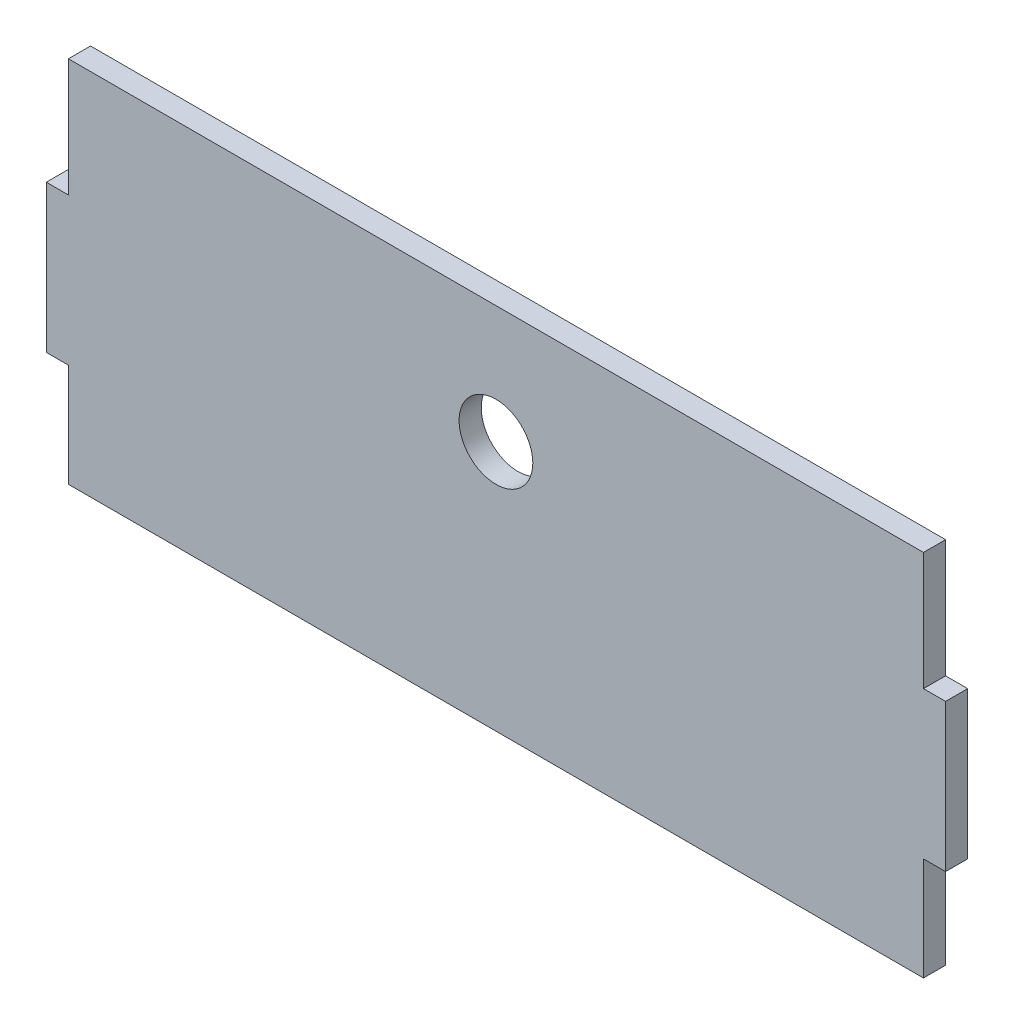
ISO-10303-21;
HEADER;
FILE_DESCRIPTION(('STEP AP214'),'2;1');
FILE_NAME('part.step','',(''),(''),'','','');
FILE_SCHEMA(('AUTOMOTIVE_DESIGN { 1 0 10303 214 1 1 1 1 }'));
ENDSEC;
DATA;
#1=APPLICATION_CONTEXT('core data for automotive mechanical design processes');
#2=APPLICATION_PROTOCOL_DEFINITION('international standard','automotive_design',2000,#1);
#3=PRODUCT_CONTEXT('',#1,'mechanical');
#4=PRODUCT('Part','Part','',(#3));
#5=PRODUCT_RELATED_PRODUCT_CATEGORY('part','',(#4));
#6=PRODUCT_DEFINITION_FORMATION('','',#4);
#7=PRODUCT_DEFINITION_CONTEXT('part definition',#1,'design');
#8=PRODUCT_DEFINITION('design','',#6,#7);
#9=PRODUCT_DEFINITION_SHAPE('','',#8);
#10=(LENGTH_UNIT() NAMED_UNIT(*) SI_UNIT(.MILLI.,.METRE.));
#11=(NAMED_UNIT(*) PLANE_ANGLE_UNIT() SI_UNIT($,.RADIAN.));
#12=(NAMED_UNIT(*) SI_UNIT($,.STERADIAN.) SOLID_ANGLE_UNIT());
#13=UNCERTAINTY_MEASURE_WITH_UNIT(LENGTH_MEASURE(1.E-05),#10,'distance_accuracy_value','');
#14=(GEOMETRIC_REPRESENTATION_CONTEXT(3) GLOBAL_UNCERTAINTY_ASSIGNED_CONTEXT((#13)) GLOBAL_UNIT_ASSIGNED_CONTEXT((#10,
#11,#12)) REPRESENTATION_CONTEXT('',''));
#15=CARTESIAN_POINT('',(0.,0.,0.));
#16=DIRECTION('',(0.,0.,1.));
#17=DIRECTION('',(1.,0.,0.));
#18=AXIS2_PLACEMENT_3D('',#15,#16,#17);
#19=CARTESIAN_POINT('',(0.,0.,3.));
#20=DIRECTION('',(0.,0.,1.));
#21=DIRECTION('',(1.,0.,0.));
#22=AXIS2_PLACEMENT_3D('',#19,#20,#21);
#23=PLANE('',#22);
#24=DIRECTION('',(-1.,0.,0.));
#25=VECTOR('',#24,1.);
#26=CARTESIAN_POINT('',(-58.,10.,3.));
#27=LINE('',#26,#25);
#28=CARTESIAN_POINT('',(-58.,10.,3.));
#29=VERTEX_POINT('',#28);
#30=CARTESIAN_POINT('',(-61.,10.,3.));
#31=VERTEX_POINT('',#30);
#32=EDGE_CURVE('E200',#29,#31,#27,.T.);
#33=ORIENTED_EDGE('',*,*,#32,.T.);
#34=DIRECTION('',(0.,-1.,0.));
#35=VECTOR('',#34,1.);
#36=CARTESIAN_POINT('',(-61.,10.,3.));
#37=LINE('',#36,#35);
#38=CARTESIAN_POINT('',(-61.,-10.,3.));
#39=VERTEX_POINT('',#38);
#40=EDGE_CURVE('E112',#31,#39,#37,.T.);
#41=ORIENTED_EDGE('',*,*,#40,.T.);
#42=DIRECTION('',(1.,0.,0.));
#43=VECTOR('',#42,1.);
#44=CARTESIAN_POINT('',(-61.,-10.,3.));
#45=LINE('',#44,#43);
#46=CARTESIAN_POINT('',(-58.,-10.,3.));
#47=VERTEX_POINT('',#46);
#48=EDGE_CURVE('E237',#39,#47,#45,.T.);
#49=ORIENTED_EDGE('',*,*,#48,.T.);
#50=DIRECTION('',(0.,-1.,0.));
#51=VECTOR('',#50,1.);
#52=CARTESIAN_POINT('',(-58.,-10.,3.));
#53=LINE('',#52,#51);
#54=CARTESIAN_POINT('',(-58.,-24.,3.));
#55=VERTEX_POINT('',#54);
#56=EDGE_CURVE('E257',#47,#55,#53,.T.);
#57=ORIENTED_EDGE('',*,*,#56,.T.);
#58=DIRECTION('',(1.,0.,0.));
#59=VECTOR('',#58,1.);
#60=CARTESIAN_POINT('',(-58.,-24.,3.));
#61=LINE('',#60,#59);
#62=CARTESIAN_POINT('',(58.,-24.,3.));
#63=VERTEX_POINT('',#62);
#64=EDGE_CURVE('E253',#55,#63,#61,.T.);
#65=ORIENTED_EDGE('',*,*,#64,.T.);
#66=DIRECTION('',(0.,1.,0.));
#67=VECTOR('',#66,1.);
#68=CARTESIAN_POINT('',(58.,-24.,3.));
#69=LINE('',#68,#67);
#70=CARTESIAN_POINT('',(58.,-10.,3.));
#71=VERTEX_POINT('',#70);
#72=EDGE_CURVE('E256',#63,#71,#69,.T.);
#73=ORIENTED_EDGE('',*,*,#72,.T.);
#74=DIRECTION('',(1.,0.,0.));
#75=VECTOR('',#74,1.);
#76=CARTESIAN_POINT('',(58.,-10.,3.));
#77=LINE('',#76,#75);
#78=CARTESIAN_POINT('',(61.,-10.,3.));
#79=VERTEX_POINT('',#78);
#80=EDGE_CURVE('E261',#71,#79,#77,.T.);
#81=ORIENTED_EDGE('',*,*,#80,.T.);
#82=DIRECTION('',(0.,1.,0.));
#83=VECTOR('',#82,1.);
#84=CARTESIAN_POINT('',(61.,-10.,3.));
#85=LINE('',#84,#83);
#86=CARTESIAN_POINT('',(61.,10.,3.));
#87=VERTEX_POINT('',#86);
#88=EDGE_CURVE('E268',#79,#87,#85,.T.);
#89=ORIENTED_EDGE('',*,*,#88,.T.);
#90=DIRECTION('',(-1.,0.,0.));
#91=VECTOR('',#90,1.);
#92=CARTESIAN_POINT('',(61.,10.,3.));
#93=LINE('',#92,#91);
#94=CARTESIAN_POINT('',(58.,10.,3.));
#95=VERTEX_POINT('',#94);
#96=EDGE_CURVE('E143',#87,#95,#93,.T.);
#97=ORIENTED_EDGE('',*,*,#96,.T.);
#98=DIRECTION('',(0.,1.,0.));
#99=VECTOR('',#98,1.);
#100=CARTESIAN_POINT('',(58.,10.,3.));
#101=LINE('',#100,#99);
#102=CARTESIAN_POINT('',(58.,26.,3.));
#103=VERTEX_POINT('',#102);
#104=EDGE_CURVE('E137',#95,#103,#101,.T.);
#105=ORIENTED_EDGE('',*,*,#104,.T.);
#106=DIRECTION('',(-1.,0.,0.));
#107=VECTOR('',#106,1.);
#108=CARTESIAN_POINT('',(58.,26.,3.));
#109=LINE('',#108,#107);
#110=CARTESIAN_POINT('',(-58.,26.,3.));
#111=VERTEX_POINT('',#110);
#112=EDGE_CURVE('E141',#103,#111,#109,.T.);
#113=ORIENTED_EDGE('',*,*,#112,.T.);
#114=DIRECTION('',(0.,-1.,0.));
#115=VECTOR('',#114,1.);
#116=CARTESIAN_POINT('',(-58.,26.,3.));
#117=LINE('',#116,#115);
#118=EDGE_CURVE('E57',#111,#29,#117,.T.);
#119=ORIENTED_EDGE('',*,*,#118,.T.);
#120=EDGE_LOOP('',(#33,#41,#49,#57,#65,#73,#81,#89,#97,#105,#113,#119));
#121=FACE_BOUND('',#120,.T.);
#122=CARTESIAN_POINT('',(0.,10.,3.));
#123=DIRECTION('',(0.,0.,1.));
#124=DIRECTION('',(1.,0.,0.));
#125=AXIS2_PLACEMENT_3D('',#122,#123,#124);
#126=CIRCLE('',#125,5.);
#127=CARTESIAN_POINT('',(5.,10.,3.));
#128=VERTEX_POINT('',#127);
#129=EDGE_CURVE('E170',#128,#128,#126,.T.);
#130=ORIENTED_EDGE('',*,*,#129,.F.);
#131=EDGE_LOOP('',(#130));
#132=FACE_BOUND('',#131,.T.);
#133=ADVANCED_FACE('F39',(#121,#132),#23,.T.);
#134=CARTESIAN_POINT('',(0.,0.,0.));
#135=DIRECTION('',(0.,0.,1.));
#136=DIRECTION('',(1.,0.,0.));
#137=AXIS2_PLACEMENT_3D('',#134,#135,#136);
#138=PLANE('',#137);
#139=DIRECTION('',(-1.,0.,0.));
#140=VECTOR('',#139,1.);
#141=CARTESIAN_POINT('',(-58.,10.,0.));
#142=LINE('',#141,#140);
#143=CARTESIAN_POINT('',(-58.,10.,0.));
#144=VERTEX_POINT('',#143);
#145=CARTESIAN_POINT('',(-61.,10.,0.));
#146=VERTEX_POINT('',#145);
#147=EDGE_CURVE('E165',#144,#146,#142,.T.);
#148=ORIENTED_EDGE('',*,*,#147,.F.);
#149=DIRECTION('',(0.,-1.,0.));
#150=VECTOR('',#149,1.);
#151=CARTESIAN_POINT('',(-58.,26.,0.));
#152=LINE('',#151,#150);
#153=CARTESIAN_POINT('',(-58.,26.,0.));
#154=VERTEX_POINT('',#153);
#155=EDGE_CURVE('E104',#154,#144,#152,.T.);
#156=ORIENTED_EDGE('',*,*,#155,.F.);
#157=DIRECTION('',(-1.,0.,0.));
#158=VECTOR('',#157,1.);
#159=CARTESIAN_POINT('',(58.,26.,0.));
#160=LINE('',#159,#158);
#161=CARTESIAN_POINT('',(58.,26.,0.));
#162=VERTEX_POINT('',#161);
#163=EDGE_CURVE('E98',#162,#154,#160,.T.);
#164=ORIENTED_EDGE('',*,*,#163,.F.);
#165=DIRECTION('',(0.,1.,0.));
#166=VECTOR('',#165,1.);
#167=CARTESIAN_POINT('',(58.,10.,0.));
#168=LINE('',#167,#166);
#169=CARTESIAN_POINT('',(58.,10.,0.));
#170=VERTEX_POINT('',#169);
#171=EDGE_CURVE('E152',#170,#162,#168,.T.);
#172=ORIENTED_EDGE('',*,*,#171,.F.);
#173=DIRECTION('',(-1.,0.,0.));
#174=VECTOR('',#173,1.);
#175=CARTESIAN_POINT('',(61.,10.,0.));
#176=LINE('',#175,#174);
#177=CARTESIAN_POINT('',(61.,10.,0.));
#178=VERTEX_POINT('',#177);
#179=EDGE_CURVE('E191',#178,#170,#176,.T.);
#180=ORIENTED_EDGE('',*,*,#179,.F.);
#181=DIRECTION('',(0.,1.,0.));
#182=VECTOR('',#181,1.);
#183=CARTESIAN_POINT('',(61.,-10.,0.));
#184=LINE('',#183,#182);
#185=CARTESIAN_POINT('',(61.,-10.,0.));
#186=VERTEX_POINT('',#185);
#187=EDGE_CURVE('E188',#186,#178,#184,.T.);
#188=ORIENTED_EDGE('',*,*,#187,.F.);
#189=DIRECTION('',(1.,0.,0.));
#190=VECTOR('',#189,1.);
#191=CARTESIAN_POINT('',(58.,-10.,0.));
#192=LINE('',#191,#190);
#193=CARTESIAN_POINT('',(58.,-10.,0.));
#194=VERTEX_POINT('',#193);
#195=EDGE_CURVE('E185',#194,#186,#192,.T.);
#196=ORIENTED_EDGE('',*,*,#195,.F.);
#197=DIRECTION('',(0.,1.,0.));
#198=VECTOR('',#197,1.);
#199=CARTESIAN_POINT('',(58.,-24.,0.));
#200=LINE('',#199,#198);
#201=CARTESIAN_POINT('',(58.,-24.,0.));
#202=VERTEX_POINT('',#201);
#203=EDGE_CURVE('E182',#202,#194,#200,.T.);
#204=ORIENTED_EDGE('',*,*,#203,.F.);
#205=DIRECTION('',(1.,0.,0.));
#206=VECTOR('',#205,1.);
#207=CARTESIAN_POINT('',(-58.,-24.,0.));
#208=LINE('',#207,#206);
#209=CARTESIAN_POINT('',(-58.,-24.,0.));
#210=VERTEX_POINT('',#209);
#211=EDGE_CURVE('E179',#210,#202,#208,.T.);
#212=ORIENTED_EDGE('',*,*,#211,.F.);
#213=DIRECTION('',(0.,-1.,0.));
#214=VECTOR('',#213,1.);
#215=CARTESIAN_POINT('',(-58.,-10.,0.));
#216=LINE('',#215,#214);
#217=CARTESIAN_POINT('',(-58.,-10.,0.));
#218=VERTEX_POINT('',#217);
#219=EDGE_CURVE('E176',#218,#210,#216,.T.);
#220=ORIENTED_EDGE('',*,*,#219,.F.);
#221=DIRECTION('',(1.,0.,0.));
#222=VECTOR('',#221,1.);
#223=CARTESIAN_POINT('',(-61.,-10.,0.));
#224=LINE('',#223,#222);
#225=CARTESIAN_POINT('',(-61.,-10.,0.));
#226=VERTEX_POINT('',#225);
#227=EDGE_CURVE('E173',#226,#218,#224,.T.);
#228=ORIENTED_EDGE('',*,*,#227,.F.);
#229=DIRECTION('',(0.,-1.,0.));
#230=VECTOR('',#229,1.);
#231=CARTESIAN_POINT('',(-61.,10.,0.));
#232=LINE('',#231,#230);
#233=EDGE_CURVE('E169',#146,#226,#232,.T.);
#234=ORIENTED_EDGE('',*,*,#233,.F.);
#235=EDGE_LOOP('',(#148,#156,#164,#172,#180,#188,#196,#204,#212,#220,#228,#234));
#236=FACE_BOUND('',#235,.T.);
#237=CARTESIAN_POINT('',(0.,10.,0.));
#238=DIRECTION('',(0.,0.,1.));
#239=DIRECTION('',(1.,0.,0.));
#240=AXIS2_PLACEMENT_3D('',#237,#238,#239);
#241=CIRCLE('',#240,5.);
#242=CARTESIAN_POINT('',(5.,10.,0.));
#243=VERTEX_POINT('',#242);
#244=EDGE_CURVE('E417',#243,#243,#241,.T.);
#245=ORIENTED_EDGE('',*,*,#244,.T.);
#246=EDGE_LOOP('',(#245));
#247=FACE_BOUND('',#246,.T.);
#248=ADVANCED_FACE('F241',(#236,#247),#138,.F.);
#249=CARTESIAN_POINT('',(-58.,10.,3.));
#250=DIRECTION('',(0.,-1.,0.));
#251=DIRECTION('',(1.,0.,0.));
#252=AXIS2_PLACEMENT_3D('',#249,#250,#251);
#253=PLANE('',#252);
#254=ORIENTED_EDGE('',*,*,#147,.T.);
#255=DIRECTION('',(0.,0.,-1.));
#256=VECTOR('',#255,1.);
#257=CARTESIAN_POINT('',(-61.,10.,3.));
#258=LINE('',#257,#256);
#259=EDGE_CURVE('E11',#31,#146,#258,.T.);
#260=ORIENTED_EDGE('',*,*,#259,.F.);
#261=ORIENTED_EDGE('',*,*,#32,.F.);
#262=DIRECTION('',(0.,0.,-1.));
#263=VECTOR('',#262,1.);
#264=CARTESIAN_POINT('',(-58.,10.,3.));
#265=LINE('',#264,#263);
#266=EDGE_CURVE('E161',#29,#144,#265,.T.);
#267=ORIENTED_EDGE('',*,*,#266,.T.);
#268=EDGE_LOOP('',(#254,#260,#261,#267));
#269=FACE_BOUND('',#268,.T.);
#270=ADVANCED_FACE('F41',(#269),#253,.F.);
#271=CARTESIAN_POINT('',(-61.,10.,3.));
#272=DIRECTION('',(1.,0.,0.));
#273=DIRECTION('',(0.,0.,-1.));
#274=AXIS2_PLACEMENT_3D('',#271,#272,#273);
#275=PLANE('',#274);
#276=ORIENTED_EDGE('',*,*,#233,.T.);
#277=DIRECTION('',(0.,0.,-1.));
#278=VECTOR('',#277,1.);
#279=CARTESIAN_POINT('',(-61.,-10.,3.));
#280=LINE('',#279,#278);
#281=EDGE_CURVE('E49',#39,#226,#280,.T.);
#282=ORIENTED_EDGE('',*,*,#281,.F.);
#283=ORIENTED_EDGE('',*,*,#40,.F.);
#284=ORIENTED_EDGE('',*,*,#259,.T.);
#285=EDGE_LOOP('',(#276,#282,#283,#284));
#286=FACE_BOUND('',#285,.T.);
#287=ADVANCED_FACE('F304',(#286),#275,.F.);
#288=CARTESIAN_POINT('',(-61.,-10.,3.));
#289=DIRECTION('',(0.,1.,0.));
#290=DIRECTION('',(-1.,0.,0.));
#291=AXIS2_PLACEMENT_3D('',#288,#289,#290);
#292=PLANE('',#291);
#293=ORIENTED_EDGE('',*,*,#227,.T.);
#294=DIRECTION('',(0.,0.,-1.));
#295=VECTOR('',#294,1.);
#296=CARTESIAN_POINT('',(-58.,-10.,3.));
#297=LINE('',#296,#295);
#298=EDGE_CURVE('E227',#47,#218,#297,.T.);
#299=ORIENTED_EDGE('',*,*,#298,.F.);
#300=ORIENTED_EDGE('',*,*,#48,.F.);
#301=ORIENTED_EDGE('',*,*,#281,.T.);
#302=EDGE_LOOP('',(#293,#299,#300,#301));
#303=FACE_BOUND('',#302,.T.);
#304=ADVANCED_FACE('F235',(#303),#292,.F.);
#305=CARTESIAN_POINT('',(-58.,-10.,3.));
#306=DIRECTION('',(1.,0.,0.));
#307=DIRECTION('',(0.,1.,0.));
#308=AXIS2_PLACEMENT_3D('',#305,#306,#307);
#309=PLANE('',#308);
#310=ORIENTED_EDGE('',*,*,#219,.T.);
#311=DIRECTION('',(0.,0.,-1.));
#312=VECTOR('',#311,1.);
#313=CARTESIAN_POINT('',(-58.,-24.,3.));
#314=LINE('',#313,#312);
#315=EDGE_CURVE('E223',#55,#210,#314,.T.);
#316=ORIENTED_EDGE('',*,*,#315,.F.);
#317=ORIENTED_EDGE('',*,*,#56,.F.);
#318=ORIENTED_EDGE('',*,*,#298,.T.);
#319=EDGE_LOOP('',(#310,#316,#317,#318));
#320=FACE_BOUND('',#319,.T.);
#321=ADVANCED_FACE('F247',(#320),#309,.F.);
#322=CARTESIAN_POINT('',(-58.,-24.,3.));
#323=DIRECTION('',(0.,1.,0.));
#324=DIRECTION('',(0.,0.,1.));
#325=AXIS2_PLACEMENT_3D('',#322,#323,#324);
#326=PLANE('',#325);
#327=ORIENTED_EDGE('',*,*,#211,.T.);
#328=DIRECTION('',(0.,0.,-1.));
#329=VECTOR('',#328,1.);
#330=CARTESIAN_POINT('',(58.,-24.,3.));
#331=LINE('',#330,#329);
#332=EDGE_CURVE('E219',#63,#202,#331,.T.);
#333=ORIENTED_EDGE('',*,*,#332,.F.);
#334=ORIENTED_EDGE('',*,*,#64,.F.);
#335=ORIENTED_EDGE('',*,*,#315,.T.);
#336=EDGE_LOOP('',(#327,#333,#334,#335));
#337=FACE_BOUND('',#336,.T.);
#338=ADVANCED_FACE('F251',(#337),#326,.F.);
#339=CARTESIAN_POINT('',(58.,-24.,3.));
#340=DIRECTION('',(-1.,0.,0.));
#341=DIRECTION('',(0.,-1.,0.));
#342=AXIS2_PLACEMENT_3D('',#339,#340,#341);
#343=PLANE('',#342);
#344=ORIENTED_EDGE('',*,*,#203,.T.);
#345=DIRECTION('',(0.,0.,-1.));
#346=VECTOR('',#345,1.);
#347=CARTESIAN_POINT('',(58.,-10.,3.));
#348=LINE('',#347,#346);
#349=EDGE_CURVE('E215',#71,#194,#348,.T.);
#350=ORIENTED_EDGE('',*,*,#349,.F.);
#351=ORIENTED_EDGE('',*,*,#72,.F.);
#352=ORIENTED_EDGE('',*,*,#332,.T.);
#353=EDGE_LOOP('',(#344,#350,#351,#352));
#354=FACE_BOUND('',#353,.T.);
#355=ADVANCED_FACE('F317',(#354),#343,.F.);
#356=CARTESIAN_POINT('',(58.,-10.,3.));
#357=DIRECTION('',(0.,1.,0.));
#358=DIRECTION('',(-1.,0.,0.));
#359=AXIS2_PLACEMENT_3D('',#356,#357,#358);
#360=PLANE('',#359);
#361=ORIENTED_EDGE('',*,*,#195,.T.);
#362=DIRECTION('',(0.,0.,-1.));
#363=VECTOR('',#362,1.);
#364=CARTESIAN_POINT('',(61.,-10.,3.));
#365=LINE('',#364,#363);
#366=EDGE_CURVE('E211',#79,#186,#365,.T.);
#367=ORIENTED_EDGE('',*,*,#366,.F.);
#368=ORIENTED_EDGE('',*,*,#80,.F.);
#369=ORIENTED_EDGE('',*,*,#349,.T.);
#370=EDGE_LOOP('',(#361,#367,#368,#369));
#371=FACE_BOUND('',#370,.T.);
#372=ADVANCED_FACE('F320',(#371),#360,.F.);
#373=CARTESIAN_POINT('',(61.,-10.,3.));
#374=DIRECTION('',(-1.,0.,0.));
#375=DIRECTION('',(0.,0.,1.));
#376=AXIS2_PLACEMENT_3D('',#373,#374,#375);
#377=PLANE('',#376);
#378=ORIENTED_EDGE('',*,*,#187,.T.);
#379=DIRECTION('',(0.,0.,-1.));
#380=VECTOR('',#379,1.);
#381=CARTESIAN_POINT('',(61.,10.,3.));
#382=LINE('',#381,#380);
#383=EDGE_CURVE('E207',#87,#178,#382,.T.);
#384=ORIENTED_EDGE('',*,*,#383,.F.);
#385=ORIENTED_EDGE('',*,*,#88,.F.);
#386=ORIENTED_EDGE('',*,*,#366,.T.);
#387=EDGE_LOOP('',(#378,#384,#385,#386));
#388=FACE_BOUND('',#387,.T.);
#389=ADVANCED_FACE('F276',(#388),#377,.F.);
#390=CARTESIAN_POINT('',(61.,10.,3.));
#391=DIRECTION('',(0.,-1.,0.));
#392=DIRECTION('',(1.,0.,0.));
#393=AXIS2_PLACEMENT_3D('',#390,#391,#392);
#394=PLANE('',#393);
#395=ORIENTED_EDGE('',*,*,#179,.T.);
#396=DIRECTION('',(0.,0.,-1.));
#397=VECTOR('',#396,1.);
#398=CARTESIAN_POINT('',(58.,10.,3.));
#399=LINE('',#398,#397);
#400=EDGE_CURVE('E154',#95,#170,#399,.T.);
#401=ORIENTED_EDGE('',*,*,#400,.F.);
#402=ORIENTED_EDGE('',*,*,#96,.F.);
#403=ORIENTED_EDGE('',*,*,#383,.T.);
#404=EDGE_LOOP('',(#395,#401,#402,#403));
#405=FACE_BOUND('',#404,.T.);
#406=ADVANCED_FACE('F280',(#405),#394,.F.);
#407=CARTESIAN_POINT('',(58.,10.,3.));
#408=DIRECTION('',(-1.,0.,0.));
#409=DIRECTION('',(0.,-1.,0.));
#410=AXIS2_PLACEMENT_3D('',#407,#408,#409);
#411=PLANE('',#410);
#412=ORIENTED_EDGE('',*,*,#171,.T.);
#413=DIRECTION('',(0.,0.,-1.));
#414=VECTOR('',#413,1.);
#415=CARTESIAN_POINT('',(58.,26.,3.));
#416=LINE('',#415,#414);
#417=EDGE_CURVE('E149',#103,#162,#416,.T.);
#418=ORIENTED_EDGE('',*,*,#417,.F.);
#419=ORIENTED_EDGE('',*,*,#104,.F.);
#420=ORIENTED_EDGE('',*,*,#400,.T.);
#421=EDGE_LOOP('',(#412,#418,#419,#420));
#422=FACE_BOUND('',#421,.T.);
#423=ADVANCED_FACE('F150',(#422),#411,.F.);
#424=CARTESIAN_POINT('',(58.,26.,3.));
#425=DIRECTION('',(0.,-1.,0.));
#426=DIRECTION('',(1.,0.,0.));
#427=AXIS2_PLACEMENT_3D('',#424,#425,#426);
#428=PLANE('',#427);
#429=ORIENTED_EDGE('',*,*,#163,.T.);
#430=DIRECTION('',(0.,0.,-1.));
#431=VECTOR('',#430,1.);
#432=CARTESIAN_POINT('',(-58.,26.,3.));
#433=LINE('',#432,#431);
#434=EDGE_CURVE('E155',#111,#154,#433,.T.);
#435=ORIENTED_EDGE('',*,*,#434,.F.);
#436=ORIENTED_EDGE('',*,*,#112,.F.);
#437=ORIENTED_EDGE('',*,*,#417,.T.);
#438=EDGE_LOOP('',(#429,#435,#436,#437));
#439=FACE_BOUND('',#438,.T.);
#440=ADVANCED_FACE('F157',(#439),#428,.F.);
#441=CARTESIAN_POINT('',(-58.,26.,3.));
#442=DIRECTION('',(1.,0.,0.));
#443=DIRECTION('',(0.,1.,0.));
#444=AXIS2_PLACEMENT_3D('',#441,#442,#443);
#445=PLANE('',#444);
#446=ORIENTED_EDGE('',*,*,#155,.T.);
#447=ORIENTED_EDGE('',*,*,#266,.F.);
#448=ORIENTED_EDGE('',*,*,#118,.F.);
#449=ORIENTED_EDGE('',*,*,#434,.T.);
#450=EDGE_LOOP('',(#446,#447,#448,#449));
#451=FACE_BOUND('',#450,.T.);
#452=ADVANCED_FACE('F284',(#451),#445,.F.);
#453=CARTESIAN_POINT('',(0.,10.,3.));
#454=DIRECTION('',(0.,0.,-1.));
#455=DIRECTION('',(-1.,0.,0.));
#456=AXIS2_PLACEMENT_3D('',#453,#454,#455);
#457=CYLINDRICAL_SURFACE('',#456,5.);
#458=ORIENTED_EDGE('',*,*,#129,.T.);
#459=EDGE_LOOP('',(#458));
#460=FACE_BOUND('',#459,.T.);
#461=ORIENTED_EDGE('',*,*,#244,.F.);
#462=EDGE_LOOP('',(#461));
#463=FACE_BOUND('',#462,.T.);
#464=ADVANCED_FACE('F286',(#460,#463),#457,.F.);
#465=CLOSED_SHELL('',(#133,#248,#270,#287,#304,#321,#338,#355,#372,#389,#406,#423,#440,#452,#464));
#466=MANIFOLD_SOLID_BREP('B2',#465);
#467=ADVANCED_BREP_SHAPE_REPRESENTATION('',(#18,#466),#14);
#468=SHAPE_DEFINITION_REPRESENTATION(#9,#467);
ENDSEC;
END-ISO-10303-21;
